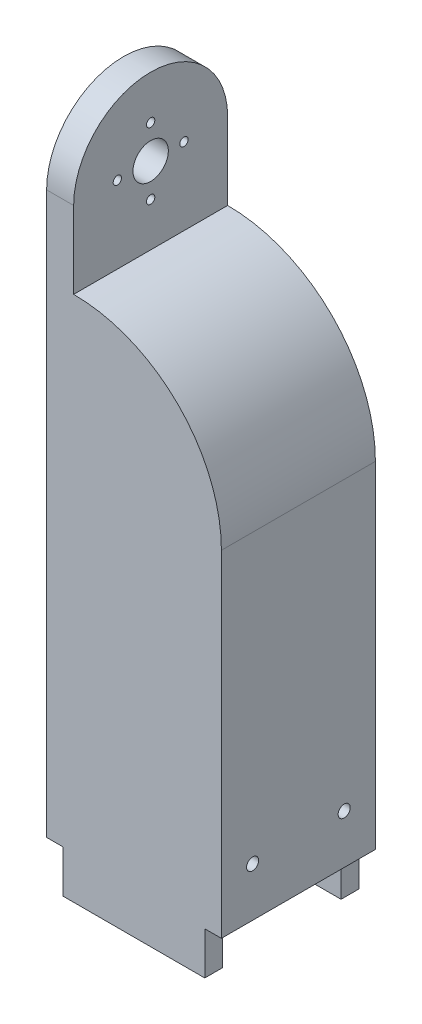
ISO-10303-21;
HEADER;
FILE_DESCRIPTION(('STEP AP214'),'2;1');
FILE_NAME('part.step','',(''),(''),'','','');
FILE_SCHEMA(('AUTOMOTIVE_DESIGN { 1 0 10303 214 1 1 1 1 }'));
ENDSEC;
DATA;
#1=APPLICATION_CONTEXT('core data for automotive mechanical design processes');
#2=APPLICATION_PROTOCOL_DEFINITION('international standard','automotive_design',2000,#1);
#3=PRODUCT_CONTEXT('',#1,'mechanical');
#4=PRODUCT('Part','Part','',(#3));
#5=PRODUCT_RELATED_PRODUCT_CATEGORY('part','',(#4));
#6=PRODUCT_DEFINITION_FORMATION('','',#4);
#7=PRODUCT_DEFINITION_CONTEXT('part definition',#1,'design');
#8=PRODUCT_DEFINITION('design','',#6,#7);
#9=PRODUCT_DEFINITION_SHAPE('','',#8);
#10=(LENGTH_UNIT() NAMED_UNIT(*) SI_UNIT(.MILLI.,.METRE.));
#11=(NAMED_UNIT(*) PLANE_ANGLE_UNIT() SI_UNIT($,.RADIAN.));
#12=(NAMED_UNIT(*) SI_UNIT($,.STERADIAN.) SOLID_ANGLE_UNIT());
#13=UNCERTAINTY_MEASURE_WITH_UNIT(LENGTH_MEASURE(1.E-05),#10,'distance_accuracy_value','');
#14=(GEOMETRIC_REPRESENTATION_CONTEXT(3) GLOBAL_UNCERTAINTY_ASSIGNED_CONTEXT((#13)) GLOBAL_UNIT_ASSIGNED_CONTEXT((#10,
#11,#12)) REPRESENTATION_CONTEXT('',''));
#15=CARTESIAN_POINT('',(0.,0.,0.));
#16=DIRECTION('',(0.,0.,1.));
#17=DIRECTION('',(1.,0.,0.));
#18=AXIS2_PLACEMENT_3D('',#15,#16,#17);
#19=CARTESIAN_POINT('',(-17.,0.,-55.));
#20=DIRECTION('',(1.,0.,0.));
#21=DIRECTION('',(0.,1.,0.));
#22=AXIS2_PLACEMENT_3D('',#19,#20,#21);
#23=PLANE('',#22);
#24=DIRECTION('',(0.,0.,1.));
#25=VECTOR('',#24,1.);
#26=CARTESIAN_POINT('',(-17.,-144.75,-55.));
#27=LINE('',#26,#25);
#28=CARTESIAN_POINT('',(-17.,-144.75,-41.75));
#29=VERTEX_POINT('',#28);
#30=CARTESIAN_POINT('',(-17.,-144.75,-13.25));
#31=VERTEX_POINT('',#30);
#32=EDGE_CURVE('E243',#29,#31,#27,.T.);
#33=ORIENTED_EDGE('',*,*,#32,.T.);
#34=DIRECTION('',(0.,1.,0.));
#35=VECTOR('',#34,1.);
#36=CARTESIAN_POINT('',(-17.,-169.75,-13.25));
#37=LINE('',#36,#35);
#38=CARTESIAN_POINT('',(-17.,-159.75,-13.25));
#39=VERTEX_POINT('',#38);
#40=EDGE_CURVE('E237',#39,#31,#37,.T.);
#41=ORIENTED_EDGE('',*,*,#40,.F.);
#42=DIRECTION('',(0.,0.,1.));
#43=VECTOR('',#42,1.);
#44=CARTESIAN_POINT('',(-17.,-159.75,-55.));
#45=LINE('',#44,#43);
#46=CARTESIAN_POINT('',(-17.,-159.75,-41.75));
#47=VERTEX_POINT('',#46);
#48=EDGE_CURVE('E213',#47,#39,#45,.T.);
#49=ORIENTED_EDGE('',*,*,#48,.F.);
#50=DIRECTION('',(0.,1.,0.));
#51=VECTOR('',#50,1.);
#52=CARTESIAN_POINT('',(-17.,-169.75,-41.75));
#53=LINE('',#52,#51);
#54=EDGE_CURVE('E220',#47,#29,#53,.T.);
#55=ORIENTED_EDGE('',*,*,#54,.T.);
#56=EDGE_LOOP('',(#33,#41,#49,#55));
#57=FACE_BOUND('',#56,.T.);
#58=CARTESIAN_POINT('',(-17.,-148.,-16.5));
#59=DIRECTION('',(1.,0.,0.));
#60=DIRECTION('',(0.,0.,-1.));
#61=AXIS2_PLACEMENT_3D('',#58,#59,#60);
#62=CIRCLE('',#61,1.45);
#63=CARTESIAN_POINT('',(-17.,-148.,-17.95));
#64=VERTEX_POINT('',#63);
#65=EDGE_CURVE('E461',#64,#64,#62,.T.);
#66=ORIENTED_EDGE('',*,*,#65,.F.);
#67=EDGE_LOOP('',(#66));
#68=FACE_BOUND('',#67,.T.);
#69=CARTESIAN_POINT('',(-17.,-148.,-38.5));
#70=DIRECTION('',(1.,0.,0.));
#71=DIRECTION('',(0.,0.,-1.));
#72=AXIS2_PLACEMENT_3D('',#69,#70,#71);
#73=CIRCLE('',#72,1.45);
#74=CARTESIAN_POINT('',(-17.,-148.,-39.95));
#75=VERTEX_POINT('',#74);
#76=EDGE_CURVE('E455',#75,#75,#73,.T.);
#77=ORIENTED_EDGE('',*,*,#76,.F.);
#78=EDGE_LOOP('',(#77));
#79=FACE_BOUND('',#78,.T.);
#80=ADVANCED_FACE('F47',(#57,#68,#79),#23,.T.);
#81=CARTESIAN_POINT('',(0.,-144.75,-55.));
#82=DIRECTION('',(0.,1.,0.));
#83=DIRECTION('',(0.,0.,1.));
#84=AXIS2_PLACEMENT_3D('',#81,#82,#83);
#85=PLANE('',#84);
#86=DIRECTION('',(-1.,0.,0.));
#87=VECTOR('',#86,1.);
#88=CARTESIAN_POINT('',(-17.,-144.75,-41.75));
#89=LINE('',#88,#87);
#90=CARTESIAN_POINT('',(17.,-144.75,-41.75));
#91=VERTEX_POINT('',#90);
#92=EDGE_CURVE('E225',#91,#29,#89,.T.);
#93=ORIENTED_EDGE('',*,*,#92,.F.);
#94=DIRECTION('',(0.,0.,1.));
#95=VECTOR('',#94,1.);
#96=CARTESIAN_POINT('',(17.,-144.75,-55.));
#97=LINE('',#96,#95);
#98=CARTESIAN_POINT('',(17.,-144.75,-13.25));
#99=VERTEX_POINT('',#98);
#100=EDGE_CURVE('E242',#91,#99,#97,.T.);
#101=ORIENTED_EDGE('',*,*,#100,.T.);
#102=DIRECTION('',(1.,0.,0.));
#103=VECTOR('',#102,1.);
#104=CARTESIAN_POINT('',(-17.,-144.75,-13.25));
#105=LINE('',#104,#103);
#106=EDGE_CURVE('E229',#31,#99,#105,.T.);
#107=ORIENTED_EDGE('',*,*,#106,.F.);
#108=ORIENTED_EDGE('',*,*,#32,.F.);
#109=EDGE_LOOP('',(#93,#101,#107,#108));
#110=FACE_BOUND('',#109,.T.);
#111=ADVANCED_FACE('F373',(#110),#85,.F.);
#112=CARTESIAN_POINT('',(17.,0.,-55.));
#113=DIRECTION('',(1.,0.,0.));
#114=DIRECTION('',(0.,0.,-1.));
#115=AXIS2_PLACEMENT_3D('',#112,#113,#114);
#116=PLANE('',#115);
#117=DIRECTION('',(0.,1.,0.));
#118=VECTOR('',#117,1.);
#119=CARTESIAN_POINT('',(17.,-169.75,-13.25));
#120=LINE('',#119,#118);
#121=CARTESIAN_POINT('',(17.,-159.75,-13.25));
#122=VERTEX_POINT('',#121);
#123=EDGE_CURVE('E233',#122,#99,#120,.T.);
#124=ORIENTED_EDGE('',*,*,#123,.T.);
#125=ORIENTED_EDGE('',*,*,#100,.F.);
#126=DIRECTION('',(0.,1.,0.));
#127=VECTOR('',#126,1.);
#128=CARTESIAN_POINT('',(17.,-169.75,-41.75));
#129=LINE('',#128,#127);
#130=CARTESIAN_POINT('',(17.,-159.75,-41.75));
#131=VERTEX_POINT('',#130);
#132=EDGE_CURVE('E216',#131,#91,#129,.T.);
#133=ORIENTED_EDGE('',*,*,#132,.F.);
#134=DIRECTION('',(0.,0.,1.));
#135=VECTOR('',#134,1.);
#136=CARTESIAN_POINT('',(17.,-159.75,-55.));
#137=LINE('',#136,#135);
#138=EDGE_CURVE('E217',#131,#122,#137,.T.);
#139=ORIENTED_EDGE('',*,*,#138,.T.);
#140=EDGE_LOOP('',(#124,#125,#133,#139));
#141=FACE_BOUND('',#140,.T.);
#142=CARTESIAN_POINT('',(17.,-148.,-16.5));
#143=DIRECTION('',(1.,0.,0.));
#144=DIRECTION('',(0.,0.,-1.));
#145=AXIS2_PLACEMENT_3D('',#142,#143,#144);
#146=CIRCLE('',#145,1.45);
#147=CARTESIAN_POINT('',(17.,-148.,-17.95));
#148=VERTEX_POINT('',#147);
#149=EDGE_CURVE('E264',#148,#148,#146,.T.);
#150=ORIENTED_EDGE('',*,*,#149,.T.);
#151=EDGE_LOOP('',(#150));
#152=FACE_BOUND('',#151,.T.);
#153=CARTESIAN_POINT('',(17.,-148.,-38.5));
#154=DIRECTION('',(1.,0.,0.));
#155=DIRECTION('',(0.,0.,-1.));
#156=AXIS2_PLACEMENT_3D('',#153,#154,#155);
#157=CIRCLE('',#156,1.45);
#158=CARTESIAN_POINT('',(17.,-148.,-39.95));
#159=VERTEX_POINT('',#158);
#160=EDGE_CURVE('E465',#159,#159,#157,.T.);
#161=ORIENTED_EDGE('',*,*,#160,.T.);
#162=EDGE_LOOP('',(#161));
#163=FACE_BOUND('',#162,.T.);
#164=ADVANCED_FACE('F380',(#141,#152,#163),#116,.F.);
#165=CARTESIAN_POINT('',(-30.,-25.,-19.5000000000001));
#166=DIRECTION('',(1.,0.,0.));
#167=DIRECTION('',(0.,1.,0.));
#168=AXIS2_PLACEMENT_3D('',#165,#166,#167);
#169=CYLINDRICAL_SURFACE('',#168,1.);
#170=CARTESIAN_POINT('',(-21.,-25.,-19.5000000000001));
#171=DIRECTION('',(1.,0.,0.));
#172=DIRECTION('',(0.,0.,-1.));
#173=AXIS2_PLACEMENT_3D('',#170,#171,#172);
#174=CIRCLE('',#173,1.);
#175=CARTESIAN_POINT('',(-21.,-25.,-20.5000000000001));
#176=VERTEX_POINT('',#175);
#177=EDGE_CURVE('E301',#176,#176,#174,.F.);
#178=ORIENTED_EDGE('',*,*,#177,.T.);
#179=EDGE_LOOP('',(#178));
#180=FACE_BOUND('',#179,.T.);
#181=CARTESIAN_POINT('',(-14.5,-25.,-19.5000000000001));
#182=DIRECTION('',(1.,0.,0.));
#183=DIRECTION('',(0.,1.,0.));
#184=AXIS2_PLACEMENT_3D('',#181,#182,#183);
#185=CIRCLE('',#184,1.);
#186=CARTESIAN_POINT('',(-14.5,-24.,-19.5000000000001));
#187=VERTEX_POINT('',#186);
#188=EDGE_CURVE('E326',#187,#187,#185,.F.);
#189=ORIENTED_EDGE('',*,*,#188,.F.);
#190=EDGE_LOOP('',(#189));
#191=FACE_BOUND('',#190,.T.);
#192=ADVANCED_FACE('F390',(#180,#191),#169,.F.);
#193=CARTESIAN_POINT('',(-30.,-33.,-27.5000000000002));
#194=DIRECTION('',(1.,0.,0.));
#195=DIRECTION('',(0.,1.,0.));
#196=AXIS2_PLACEMENT_3D('',#193,#194,#195);
#197=CYLINDRICAL_SURFACE('',#196,1.);
#198=CARTESIAN_POINT('',(-21.,-33.,-27.5000000000002));
#199=DIRECTION('',(1.,0.,0.));
#200=DIRECTION('',(0.,0.,-1.));
#201=AXIS2_PLACEMENT_3D('',#198,#199,#200);
#202=CIRCLE('',#201,1.);
#203=CARTESIAN_POINT('',(-21.,-33.,-28.5000000000002));
#204=VERTEX_POINT('',#203);
#205=EDGE_CURVE('E297',#204,#204,#202,.F.);
#206=ORIENTED_EDGE('',*,*,#205,.T.);
#207=EDGE_LOOP('',(#206));
#208=FACE_BOUND('',#207,.T.);
#209=CARTESIAN_POINT('',(-14.5,-33.,-27.5000000000002));
#210=DIRECTION('',(1.,0.,0.));
#211=DIRECTION('',(0.,1.,0.));
#212=AXIS2_PLACEMENT_3D('',#209,#210,#211);
#213=CIRCLE('',#212,1.);
#214=CARTESIAN_POINT('',(-14.5,-32.,-27.5000000000002));
#215=VERTEX_POINT('',#214);
#216=EDGE_CURVE('E330',#215,#215,#213,.F.);
#217=ORIENTED_EDGE('',*,*,#216,.F.);
#218=EDGE_LOOP('',(#217));
#219=FACE_BOUND('',#218,.T.);
#220=ADVANCED_FACE('F49',(#208,#219),#197,.F.);
#221=CARTESIAN_POINT('',(-30.,-24.9999999999999,-35.5000000000001));
#222=DIRECTION('',(1.,0.,0.));
#223=DIRECTION('',(0.,1.,0.));
#224=AXIS2_PLACEMENT_3D('',#221,#222,#223);
#225=CYLINDRICAL_SURFACE('',#224,1.);
#226=CARTESIAN_POINT('',(-21.,-24.9999999999999,-35.5000000000001));
#227=DIRECTION('',(1.,0.,0.));
#228=DIRECTION('',(0.,0.,-1.));
#229=AXIS2_PLACEMENT_3D('',#226,#227,#228);
#230=CIRCLE('',#229,1.);
#231=CARTESIAN_POINT('',(-21.,-24.9999999999999,-36.5000000000001));
#232=VERTEX_POINT('',#231);
#233=EDGE_CURVE('E293',#232,#232,#230,.F.);
#234=ORIENTED_EDGE('',*,*,#233,.T.);
#235=EDGE_LOOP('',(#234));
#236=FACE_BOUND('',#235,.T.);
#237=CARTESIAN_POINT('',(-14.5,-24.9999999999999,-35.5000000000001));
#238=DIRECTION('',(1.,0.,0.));
#239=DIRECTION('',(0.,1.,0.));
#240=AXIS2_PLACEMENT_3D('',#237,#238,#239);
#241=CIRCLE('',#240,1.);
#242=CARTESIAN_POINT('',(-14.5,-23.9999999999999,-35.5000000000001));
#243=VERTEX_POINT('',#242);
#244=EDGE_CURVE('E318',#243,#243,#241,.F.);
#245=ORIENTED_EDGE('',*,*,#244,.F.);
#246=EDGE_LOOP('',(#245));
#247=FACE_BOUND('',#246,.T.);
#248=ADVANCED_FACE('F396',(#236,#247),#225,.F.);
#249=CARTESIAN_POINT('',(-30.,-17.,-27.5));
#250=DIRECTION('',(1.,0.,0.));
#251=DIRECTION('',(0.,1.,0.));
#252=AXIS2_PLACEMENT_3D('',#249,#250,#251);
#253=CYLINDRICAL_SURFACE('',#252,1.);
#254=CARTESIAN_POINT('',(-21.,-17.,-27.5));
#255=DIRECTION('',(1.,0.,0.));
#256=DIRECTION('',(0.,0.,-1.));
#257=AXIS2_PLACEMENT_3D('',#254,#255,#256);
#258=CIRCLE('',#257,1.);
#259=CARTESIAN_POINT('',(-21.,-17.,-28.5));
#260=VERTEX_POINT('',#259);
#261=EDGE_CURVE('E289',#260,#260,#258,.F.);
#262=ORIENTED_EDGE('',*,*,#261,.T.);
#263=EDGE_LOOP('',(#262));
#264=FACE_BOUND('',#263,.T.);
#265=CARTESIAN_POINT('',(-14.5,-17.,-27.5));
#266=DIRECTION('',(1.,0.,0.));
#267=DIRECTION('',(0.,1.,0.));
#268=AXIS2_PLACEMENT_3D('',#265,#266,#267);
#269=CIRCLE('',#268,1.);
#270=CARTESIAN_POINT('',(-14.5,-16.,-27.5));
#271=VERTEX_POINT('',#270);
#272=EDGE_CURVE('E334',#271,#271,#269,.F.);
#273=ORIENTED_EDGE('',*,*,#272,.F.);
#274=EDGE_LOOP('',(#273));
#275=FACE_BOUND('',#274,.T.);
#276=ADVANCED_FACE('F392',(#264,#275),#253,.F.);
#277=CARTESIAN_POINT('',(-30.,-25.,-27.5));
#278=DIRECTION('',(1.,0.,0.));
#279=DIRECTION('',(0.,1.,0.));
#280=AXIS2_PLACEMENT_3D('',#277,#278,#279);
#281=CYLINDRICAL_SURFACE('',#280,4.25);
#282=CARTESIAN_POINT('',(-21.,-25.,-27.5));
#283=DIRECTION('',(1.,0.,0.));
#284=DIRECTION('',(0.,0.,-1.));
#285=AXIS2_PLACEMENT_3D('',#282,#283,#284);
#286=CIRCLE('',#285,4.25);
#287=CARTESIAN_POINT('',(-21.,-25.,-31.75));
#288=VERTEX_POINT('',#287);
#289=EDGE_CURVE('E285',#288,#288,#286,.F.);
#290=ORIENTED_EDGE('',*,*,#289,.T.);
#291=EDGE_LOOP('',(#290));
#292=FACE_BOUND('',#291,.T.);
#293=CARTESIAN_POINT('',(-14.5,-25.,-27.5));
#294=DIRECTION('',(1.,0.,0.));
#295=DIRECTION('',(0.,1.,0.));
#296=AXIS2_PLACEMENT_3D('',#293,#294,#295);
#297=CIRCLE('',#296,4.25);
#298=CARTESIAN_POINT('',(-14.5,-20.75,-27.5));
#299=VERTEX_POINT('',#298);
#300=EDGE_CURVE('E322',#299,#299,#297,.F.);
#301=ORIENTED_EDGE('',*,*,#300,.F.);
#302=EDGE_LOOP('',(#301));
#303=FACE_BOUND('',#302,.T.);
#304=ADVANCED_FACE('F395',(#292,#303),#281,.F.);
#305=CARTESIAN_POINT('',(-17.,-169.75,-13.25));
#306=DIRECTION('',(0.,0.,1.));
#307=DIRECTION('',(1.,0.,0.));
#308=AXIS2_PLACEMENT_3D('',#305,#306,#307);
#309=PLANE('',#308);
#310=ORIENTED_EDGE('',*,*,#106,.T.);
#311=ORIENTED_EDGE('',*,*,#123,.F.);
#312=CARTESIAN_POINT('',(17.,-170.,-13.25));
#313=VERTEX_POINT('',#312);
#314=EDGE_CURVE('E234',#313,#122,#120,.T.);
#315=ORIENTED_EDGE('',*,*,#314,.F.);
#316=DIRECTION('',(1.,0.,0.));
#317=VECTOR('',#316,1.);
#318=CARTESIAN_POINT('',(0.,-170.,-13.25));
#319=LINE('',#318,#317);
#320=CARTESIAN_POINT('',(-17.,-170.,-13.25));
#321=VERTEX_POINT('',#320);
#322=EDGE_CURVE('E192',#321,#313,#319,.T.);
#323=ORIENTED_EDGE('',*,*,#322,.F.);
#324=EDGE_CURVE('E238',#321,#39,#37,.T.);
#325=ORIENTED_EDGE('',*,*,#324,.T.);
#326=ORIENTED_EDGE('',*,*,#40,.T.);
#327=EDGE_LOOP('',(#310,#311,#315,#323,#325,#326));
#328=FACE_BOUND('',#327,.T.);
#329=ADVANCED_FACE('F385',(#328),#309,.F.);
#330=CARTESIAN_POINT('',(-17.,-169.75,-41.75));
#331=DIRECTION('',(0.,0.,-1.));
#332=DIRECTION('',(-1.,0.,0.));
#333=AXIS2_PLACEMENT_3D('',#330,#331,#332);
#334=PLANE('',#333);
#335=ORIENTED_EDGE('',*,*,#92,.T.);
#336=ORIENTED_EDGE('',*,*,#54,.F.);
#337=CARTESIAN_POINT('',(-17.,-170.,-41.75));
#338=VERTEX_POINT('',#337);
#339=EDGE_CURVE('E221',#338,#47,#53,.T.);
#340=ORIENTED_EDGE('',*,*,#339,.F.);
#341=DIRECTION('',(1.,0.,0.));
#342=VECTOR('',#341,1.);
#343=CARTESIAN_POINT('',(0.,-170.,-41.75));
#344=LINE('',#343,#342);
#345=CARTESIAN_POINT('',(17.,-170.,-41.75));
#346=VERTEX_POINT('',#345);
#347=EDGE_CURVE('E188',#338,#346,#344,.T.);
#348=ORIENTED_EDGE('',*,*,#347,.T.);
#349=EDGE_CURVE('E185',#346,#131,#129,.T.);
#350=ORIENTED_EDGE('',*,*,#349,.T.);
#351=ORIENTED_EDGE('',*,*,#132,.T.);
#352=EDGE_LOOP('',(#335,#336,#340,#348,#350,#351));
#353=FACE_BOUND('',#352,.T.);
#354=ADVANCED_FACE('F525',(#353),#334,.F.);
#355=CARTESIAN_POINT('',(17.,0.,0.));
#356=DIRECTION('',(1.,0.,0.));
#357=DIRECTION('',(0.,1.,0.));
#358=AXIS2_PLACEMENT_3D('',#355,#356,#357);
#359=PLANE('',#358);
#360=DIRECTION('',(0.,1.,0.));
#361=VECTOR('',#360,1.);
#362=CARTESIAN_POINT('',(17.,0.,-9.00000000000001));
#363=LINE('',#362,#361);
#364=CARTESIAN_POINT('',(17.,-170.,-9.00000000000001));
#365=VERTEX_POINT('',#364);
#366=CARTESIAN_POINT('',(17.,-159.75,-9.00000000000001));
#367=VERTEX_POINT('',#366);
#368=EDGE_CURVE('E269',#365,#367,#363,.T.);
#369=ORIENTED_EDGE('',*,*,#368,.F.);
#370=DIRECTION('',(0.,0.,1.));
#371=VECTOR('',#370,1.);
#372=CARTESIAN_POINT('',(17.,-170.,-13.25));
#373=LINE('',#372,#371);
#374=EDGE_CURVE('E201',#313,#365,#373,.T.);
#375=ORIENTED_EDGE('',*,*,#374,.F.);
#376=ORIENTED_EDGE('',*,*,#314,.T.);
#377=EDGE_CURVE('E212',#122,#367,#137,.T.);
#378=ORIENTED_EDGE('',*,*,#377,.T.);
#379=EDGE_LOOP('',(#369,#375,#376,#378));
#380=FACE_BOUND('',#379,.T.);
#381=ADVANCED_FACE('F507',(#380),#359,.T.);
#382=DIRECTION('',(0.,-1.,0.));
#383=VECTOR('',#382,1.);
#384=CARTESIAN_POINT('',(17.,0.,-46.));
#385=LINE('',#384,#383);
#386=CARTESIAN_POINT('',(17.,-159.75,-46.));
#387=VERTEX_POINT('',#386);
#388=CARTESIAN_POINT('',(17.,-170.,-46.));
#389=VERTEX_POINT('',#388);
#390=EDGE_CURVE('E159',#387,#389,#385,.T.);
#391=ORIENTED_EDGE('',*,*,#390,.F.);
#392=EDGE_CURVE('E70',#387,#131,#137,.T.);
#393=ORIENTED_EDGE('',*,*,#392,.T.);
#394=ORIENTED_EDGE('',*,*,#349,.F.);
#395=DIRECTION('',(0.,0.,-1.));
#396=VECTOR('',#395,1.);
#397=CARTESIAN_POINT('',(17.,-170.,-41.75));
#398=LINE('',#397,#396);
#399=EDGE_CURVE('E176',#346,#389,#398,.T.);
#400=ORIENTED_EDGE('',*,*,#399,.T.);
#401=EDGE_LOOP('',(#391,#393,#394,#400));
#402=FACE_BOUND('',#401,.T.);
#403=ADVANCED_FACE('F183',(#402),#359,.T.);
#404=CARTESIAN_POINT('',(17.,-159.75,-55.));
#405=DIRECTION('',(0.,1.,0.));
#406=DIRECTION('',(-1.,0.,0.));
#407=AXIS2_PLACEMENT_3D('',#404,#405,#406);
#408=PLANE('',#407);
#409=DIRECTION('',(0.,0.,1.));
#410=VECTOR('',#409,1.);
#411=CARTESIAN_POINT('',(21.,-159.75,-55.));
#412=LINE('',#411,#410);
#413=CARTESIAN_POINT('',(21.,-159.75,-46.));
#414=VERTEX_POINT('',#413);
#415=CARTESIAN_POINT('',(21.,-159.75,-9.00000000000001));
#416=VERTEX_POINT('',#415);
#417=EDGE_CURVE('E262',#414,#416,#412,.T.);
#418=ORIENTED_EDGE('',*,*,#417,.T.);
#419=DIRECTION('',(-1.,0.,0.));
#420=VECTOR('',#419,1.);
#421=CARTESIAN_POINT('',(17.,-159.75,-9.00000000000001));
#422=LINE('',#421,#420);
#423=EDGE_CURVE('E276',#416,#367,#422,.T.);
#424=ORIENTED_EDGE('',*,*,#423,.T.);
#425=ORIENTED_EDGE('',*,*,#377,.F.);
#426=ORIENTED_EDGE('',*,*,#138,.F.);
#427=ORIENTED_EDGE('',*,*,#392,.F.);
#428=DIRECTION('',(1.,0.,0.));
#429=VECTOR('',#428,1.);
#430=CARTESIAN_POINT('',(17.,-159.75,-46.));
#431=LINE('',#430,#429);
#432=EDGE_CURVE('E166',#387,#414,#431,.T.);
#433=ORIENTED_EDGE('',*,*,#432,.T.);
#434=EDGE_LOOP('',(#418,#424,#425,#426,#427,#433));
#435=FACE_BOUND('',#434,.T.);
#436=ADVANCED_FACE('F503',(#435),#408,.F.);
#437=CARTESIAN_POINT('',(-17.,0.,0.));
#438=DIRECTION('',(-1.,0.,0.));
#439=DIRECTION('',(0.,1.,0.));
#440=AXIS2_PLACEMENT_3D('',#437,#438,#439);
#441=PLANE('',#440);
#442=DIRECTION('',(0.,-1.,0.));
#443=VECTOR('',#442,1.);
#444=CARTESIAN_POINT('',(-17.,0.,-9.00000000000001));
#445=LINE('',#444,#443);
#446=CARTESIAN_POINT('',(-17.,-159.75,-9.00000000000001));
#447=VERTEX_POINT('',#446);
#448=CARTESIAN_POINT('',(-17.,-170.,-9.00000000000001));
#449=VERTEX_POINT('',#448);
#450=EDGE_CURVE('E496',#447,#449,#445,.T.);
#451=ORIENTED_EDGE('',*,*,#450,.F.);
#452=EDGE_CURVE('E205',#39,#447,#45,.T.);
#453=ORIENTED_EDGE('',*,*,#452,.F.);
#454=ORIENTED_EDGE('',*,*,#324,.F.);
#455=DIRECTION('',(0.,0.,1.));
#456=VECTOR('',#455,1.);
#457=CARTESIAN_POINT('',(-17.,-170.,-13.25));
#458=LINE('',#457,#456);
#459=EDGE_CURVE('E200',#321,#449,#458,.T.);
#460=ORIENTED_EDGE('',*,*,#459,.T.);
#461=EDGE_LOOP('',(#451,#453,#454,#460));
#462=FACE_BOUND('',#461,.T.);
#463=ADVANCED_FACE('F534',(#462),#441,.T.);
#464=DIRECTION('',(0.,1.,0.));
#465=VECTOR('',#464,1.);
#466=CARTESIAN_POINT('',(-17.,0.,-46.));
#467=LINE('',#466,#465);
#468=CARTESIAN_POINT('',(-17.,-170.,-46.));
#469=VERTEX_POINT('',#468);
#470=CARTESIAN_POINT('',(-17.,-159.75,-46.));
#471=VERTEX_POINT('',#470);
#472=EDGE_CURVE('E489',#469,#471,#467,.T.);
#473=ORIENTED_EDGE('',*,*,#472,.F.);
#474=DIRECTION('',(0.,0.,-1.));
#475=VECTOR('',#474,1.);
#476=CARTESIAN_POINT('',(-17.,-170.,-41.75));
#477=LINE('',#476,#475);
#478=EDGE_CURVE('E178',#338,#469,#477,.T.);
#479=ORIENTED_EDGE('',*,*,#478,.F.);
#480=ORIENTED_EDGE('',*,*,#339,.T.);
#481=EDGE_CURVE('E209',#471,#47,#45,.T.);
#482=ORIENTED_EDGE('',*,*,#481,.F.);
#483=EDGE_LOOP('',(#473,#479,#480,#482));
#484=FACE_BOUND('',#483,.T.);
#485=ADVANCED_FACE('F547',(#484),#441,.T.);
#486=CARTESIAN_POINT('',(-17.,-159.75,-55.));
#487=DIRECTION('',(0.,-1.,0.));
#488=DIRECTION('',(1.,0.,0.));
#489=AXIS2_PLACEMENT_3D('',#486,#487,#488);
#490=PLANE('',#489);
#491=DIRECTION('',(1.,0.,0.));
#492=VECTOR('',#491,1.);
#493=CARTESIAN_POINT('',(-17.,-159.75,-9.00000000000001));
#494=LINE('',#493,#492);
#495=CARTESIAN_POINT('',(-21.,-159.75,-9.00000000000001));
#496=VERTEX_POINT('',#495);
#497=EDGE_CURVE('E169',#496,#447,#494,.T.);
#498=ORIENTED_EDGE('',*,*,#497,.F.);
#499=DIRECTION('',(0.,0.,1.));
#500=VECTOR('',#499,1.);
#501=CARTESIAN_POINT('',(-21.,-159.75,-55.));
#502=LINE('',#501,#500);
#503=CARTESIAN_POINT('',(-21.,-159.75,-46.));
#504=VERTEX_POINT('',#503);
#505=EDGE_CURVE('E338',#504,#496,#502,.T.);
#506=ORIENTED_EDGE('',*,*,#505,.F.);
#507=DIRECTION('',(-1.,0.,0.));
#508=VECTOR('',#507,1.);
#509=CARTESIAN_POINT('',(-17.,-159.75,-46.));
#510=LINE('',#509,#508);
#511=EDGE_CURVE('E485',#471,#504,#510,.T.);
#512=ORIENTED_EDGE('',*,*,#511,.F.);
#513=ORIENTED_EDGE('',*,*,#481,.T.);
#514=ORIENTED_EDGE('',*,*,#48,.T.);
#515=ORIENTED_EDGE('',*,*,#452,.T.);
#516=EDGE_LOOP('',(#498,#506,#512,#513,#514,#515));
#517=FACE_BOUND('',#516,.T.);
#518=ADVANCED_FACE('F541',(#517),#490,.T.);
#519=CARTESIAN_POINT('',(0.,-170.,-13.25));
#520=DIRECTION('',(0.,-1.,0.));
#521=DIRECTION('',(0.,0.,-1.));
#522=AXIS2_PLACEMENT_3D('',#519,#520,#521);
#523=PLANE('',#522);
#524=DIRECTION('',(1.,0.,0.));
#525=VECTOR('',#524,1.);
#526=CARTESIAN_POINT('',(-21.,-170.,-9.00000000000001));
#527=LINE('',#526,#525);
#528=EDGE_CURVE('E180',#449,#365,#527,.T.);
#529=ORIENTED_EDGE('',*,*,#528,.F.);
#530=ORIENTED_EDGE('',*,*,#459,.F.);
#531=ORIENTED_EDGE('',*,*,#322,.T.);
#532=ORIENTED_EDGE('',*,*,#374,.T.);
#533=EDGE_LOOP('',(#529,#530,#531,#532));
#534=FACE_BOUND('',#533,.T.);
#535=ADVANCED_FACE('F539',(#534),#523,.T.);
#536=CARTESIAN_POINT('',(0.,-170.,-41.75));
#537=DIRECTION('',(0.,1.,0.));
#538=DIRECTION('',(0.,0.,1.));
#539=AXIS2_PLACEMENT_3D('',#536,#537,#538);
#540=PLANE('',#539);
#541=ORIENTED_EDGE('',*,*,#478,.T.);
#542=DIRECTION('',(-1.,0.,0.));
#543=VECTOR('',#542,1.);
#544=CARTESIAN_POINT('',(21.,-170.,-46.));
#545=LINE('',#544,#543);
#546=EDGE_CURVE('E163',#389,#469,#545,.T.);
#547=ORIENTED_EDGE('',*,*,#546,.F.);
#548=ORIENTED_EDGE('',*,*,#399,.F.);
#549=ORIENTED_EDGE('',*,*,#347,.F.);
#550=EDGE_LOOP('',(#541,#547,#548,#549));
#551=FACE_BOUND('',#550,.T.);
#552=ADVANCED_FACE('F174',(#551),#540,.F.);
#553=CARTESIAN_POINT('',(-25.,-25.,-27.5));
#554=DIRECTION('',(1.,0.,0.));
#555=DIRECTION('',(0.,1.,0.));
#556=AXIS2_PLACEMENT_3D('',#553,#554,#555);
#557=CYLINDRICAL_SURFACE('',#556,18.5);
#558=DIRECTION('',(1.,0.,0.));
#559=VECTOR('',#558,1.);
#560=CARTESIAN_POINT('',(-25.,-25.,-46.));
#561=LINE('',#560,#559);
#562=CARTESIAN_POINT('',(-21.,-25.,-46.));
#563=VERTEX_POINT('',#562);
#564=CARTESIAN_POINT('',(-14.5,-25.,-46.));
#565=VERTEX_POINT('',#564);
#566=EDGE_CURVE('E342',#563,#565,#561,.T.);
#567=ORIENTED_EDGE('',*,*,#566,.F.);
#568=CARTESIAN_POINT('',(-21.,-25.,-27.5));
#569=DIRECTION('',(1.,0.,0.));
#570=DIRECTION('',(0.,0.,-1.));
#571=AXIS2_PLACEMENT_3D('',#568,#569,#570);
#572=CIRCLE('',#571,18.5);
#573=CARTESIAN_POINT('',(-21.,-25.,-9.00000000000001));
#574=VERTEX_POINT('',#573);
#575=EDGE_CURVE('E274',#574,#563,#572,.F.);
#576=ORIENTED_EDGE('',*,*,#575,.F.);
#577=DIRECTION('',(1.,0.,0.));
#578=VECTOR('',#577,1.);
#579=CARTESIAN_POINT('',(-25.,-25.,-9.00000000000001));
#580=LINE('',#579,#578);
#581=CARTESIAN_POINT('',(-14.5,-25.,-9.00000000000001));
#582=VERTEX_POINT('',#581);
#583=EDGE_CURVE('E194',#574,#582,#580,.T.);
#584=ORIENTED_EDGE('',*,*,#583,.T.);
#585=CARTESIAN_POINT('',(-14.5,-25.,-27.5));
#586=DIRECTION('',(1.,0.,0.));
#587=DIRECTION('',(0.,1.,0.));
#588=AXIS2_PLACEMENT_3D('',#585,#586,#587);
#589=CIRCLE('',#588,18.5);
#590=EDGE_CURVE('E305',#565,#582,#589,.T.);
#591=ORIENTED_EDGE('',*,*,#590,.F.);
#592=EDGE_LOOP('',(#567,#576,#584,#591));
#593=FACE_BOUND('',#592,.T.);
#594=ADVANCED_FACE('F356',(#593),#557,.T.);
#595=CARTESIAN_POINT('',(-25.,0.,-9.00000000000001));
#596=DIRECTION('',(0.,0.,1.));
#597=DIRECTION('',(1.,0.,0.));
#598=AXIS2_PLACEMENT_3D('',#595,#596,#597);
#599=PLANE('',#598);
#600=DIRECTION('',(0.,1.,0.));
#601=VECTOR('',#600,1.);
#602=CARTESIAN_POINT('',(-21.,0.,-9.00000000000001));
#603=LINE('',#602,#601);
#604=EDGE_CURVE('E282',#496,#574,#603,.T.);
#605=ORIENTED_EDGE('',*,*,#604,.F.);
#606=ORIENTED_EDGE('',*,*,#497,.T.);
#607=ORIENTED_EDGE('',*,*,#450,.T.);
#608=ORIENTED_EDGE('',*,*,#528,.T.);
#609=ORIENTED_EDGE('',*,*,#368,.T.);
#610=ORIENTED_EDGE('',*,*,#423,.F.);
#611=DIRECTION('',(0.,-1.,0.));
#612=VECTOR('',#611,1.);
#613=CARTESIAN_POINT('',(21.,-6.50000000000003,-9.00000000000001));
#614=LINE('',#613,#612);
#615=CARTESIAN_POINT('',(21.,-79.0000000000003,-9.00000000000001));
#616=VERTEX_POINT('',#615);
#617=EDGE_CURVE('E62',#616,#416,#614,.T.);
#618=ORIENTED_EDGE('',*,*,#617,.F.);
#619=CARTESIAN_POINT('',(-14.5,-79.,-9.00000000000001));
#620=DIRECTION('',(0.,0.,-1.));
#621=DIRECTION('',(-1.,0.,0.));
#622=AXIS2_PLACEMENT_3D('',#619,#620,#621);
#623=CIRCLE('',#622,35.5);
#624=CARTESIAN_POINT('',(-14.5000000000002,-43.5,-9.00000000000001));
#625=VERTEX_POINT('',#624);
#626=EDGE_CURVE('E11',#616,#625,#623,.F.);
#627=ORIENTED_EDGE('',*,*,#626,.T.);
#628=DIRECTION('',(0.,-1.,0.));
#629=VECTOR('',#628,1.);
#630=CARTESIAN_POINT('',(-14.5,0.,-9.00000000000001));
#631=LINE('',#630,#629);
#632=EDGE_CURVE('E309',#582,#625,#631,.T.);
#633=ORIENTED_EDGE('',*,*,#632,.F.);
#634=ORIENTED_EDGE('',*,*,#583,.F.);
#635=EDGE_LOOP('',(#605,#606,#607,#608,#609,#610,#618,#627,#633,#634));
#636=FACE_BOUND('',#635,.T.);
#637=ADVANCED_FACE('F359',(#636),#599,.T.);
#638=CARTESIAN_POINT('',(-25.,0.,-46.));
#639=DIRECTION('',(0.,0.,1.));
#640=DIRECTION('',(1.,0.,0.));
#641=AXIS2_PLACEMENT_3D('',#638,#639,#640);
#642=PLANE('',#641);
#643=DIRECTION('',(0.,1.,0.));
#644=VECTOR('',#643,1.);
#645=CARTESIAN_POINT('',(-14.5,0.,-46.));
#646=LINE('',#645,#644);
#647=CARTESIAN_POINT('',(-14.5,-43.5,-46.));
#648=VERTEX_POINT('',#647);
#649=EDGE_CURVE('E250',#648,#565,#646,.T.);
#650=ORIENTED_EDGE('',*,*,#649,.F.);
#651=CARTESIAN_POINT('',(-14.5,-79.,-46.));
#652=DIRECTION('',(0.,0.,1.));
#653=DIRECTION('',(1.,0.,0.));
#654=AXIS2_PLACEMENT_3D('',#651,#652,#653);
#655=CIRCLE('',#654,35.5);
#656=CARTESIAN_POINT('',(21.,-79.,-46.));
#657=VERTEX_POINT('',#656);
#658=EDGE_CURVE('E56',#648,#657,#655,.F.);
#659=ORIENTED_EDGE('',*,*,#658,.T.);
#660=DIRECTION('',(0.,-1.,0.));
#661=VECTOR('',#660,1.);
#662=CARTESIAN_POINT('',(21.,-6.50000000000003,-46.));
#663=LINE('',#662,#661);
#664=EDGE_CURVE('E181',#657,#414,#663,.T.);
#665=ORIENTED_EDGE('',*,*,#664,.T.);
#666=ORIENTED_EDGE('',*,*,#432,.F.);
#667=ORIENTED_EDGE('',*,*,#390,.T.);
#668=ORIENTED_EDGE('',*,*,#546,.T.);
#669=ORIENTED_EDGE('',*,*,#472,.T.);
#670=ORIENTED_EDGE('',*,*,#511,.T.);
#671=DIRECTION('',(0.,1.,0.));
#672=VECTOR('',#671,1.);
#673=CARTESIAN_POINT('',(-21.,0.,-46.));
#674=LINE('',#673,#672);
#675=EDGE_CURVE('E268',#504,#563,#674,.T.);
#676=ORIENTED_EDGE('',*,*,#675,.T.);
#677=ORIENTED_EDGE('',*,*,#566,.T.);
#678=EDGE_LOOP('',(#650,#659,#665,#666,#667,#668,#669,#670,#676,#677));
#679=FACE_BOUND('',#678,.T.);
#680=ADVANCED_FACE('F162',(#679),#642,.F.);
#681=CARTESIAN_POINT('',(-21.,-159.75,-55.));
#682=DIRECTION('',(1.,0.,0.));
#683=DIRECTION('',(0.,0.,-1.));
#684=AXIS2_PLACEMENT_3D('',#681,#682,#683);
#685=PLANE('',#684);
#686=ORIENTED_EDGE('',*,*,#505,.T.);
#687=ORIENTED_EDGE('',*,*,#604,.T.);
#688=ORIENTED_EDGE('',*,*,#575,.T.);
#689=ORIENTED_EDGE('',*,*,#675,.F.);
#690=EDGE_LOOP('',(#686,#687,#688,#689));
#691=FACE_BOUND('',#690,.T.);
#692=ORIENTED_EDGE('',*,*,#205,.F.);
#693=EDGE_LOOP('',(#692));
#694=FACE_BOUND('',#693,.T.);
#695=ORIENTED_EDGE('',*,*,#261,.F.);
#696=EDGE_LOOP('',(#695));
#697=FACE_BOUND('',#696,.T.);
#698=ORIENTED_EDGE('',*,*,#289,.F.);
#699=EDGE_LOOP('',(#698));
#700=FACE_BOUND('',#699,.T.);
#701=ORIENTED_EDGE('',*,*,#233,.F.);
#702=EDGE_LOOP('',(#701));
#703=FACE_BOUND('',#702,.T.);
#704=ORIENTED_EDGE('',*,*,#177,.F.);
#705=EDGE_LOOP('',(#704));
#706=FACE_BOUND('',#705,.T.);
#707=CARTESIAN_POINT('',(-21.,-148.,-16.5));
#708=DIRECTION('',(1.,0.,0.));
#709=DIRECTION('',(0.,0.,-1.));
#710=AXIS2_PLACEMENT_3D('',#707,#708,#709);
#711=CIRCLE('',#710,1.45);
#712=CARTESIAN_POINT('',(-21.,-148.,-17.95));
#713=VERTEX_POINT('',#712);
#714=EDGE_CURVE('E449',#713,#713,#711,.T.);
#715=ORIENTED_EDGE('',*,*,#714,.T.);
#716=EDGE_LOOP('',(#715));
#717=FACE_BOUND('',#716,.T.);
#718=CARTESIAN_POINT('',(-21.,-148.,-38.5));
#719=DIRECTION('',(1.,0.,0.));
#720=DIRECTION('',(0.,0.,-1.));
#721=AXIS2_PLACEMENT_3D('',#718,#719,#720);
#722=CIRCLE('',#721,1.45);
#723=CARTESIAN_POINT('',(-21.,-148.,-39.95));
#724=VERTEX_POINT('',#723);
#725=EDGE_CURVE('E452',#724,#724,#722,.T.);
#726=ORIENTED_EDGE('',*,*,#725,.T.);
#727=EDGE_LOOP('',(#726));
#728=FACE_BOUND('',#727,.T.);
#729=ADVANCED_FACE('F367',(#691,#694,#697,#700,#703,#706,#717,#728),#685,.F.);
#730=CARTESIAN_POINT('',(21.,-159.75,-55.));
#731=DIRECTION('',(-1.,0.,0.));
#732=DIRECTION('',(0.,0.,1.));
#733=AXIS2_PLACEMENT_3D('',#730,#731,#732);
#734=PLANE('',#733);
#735=DIRECTION('',(0.,0.,1.));
#736=VECTOR('',#735,1.);
#737=CARTESIAN_POINT('',(21.,-79.0000000000003,-55.));
#738=LINE('',#737,#736);
#739=EDGE_CURVE('E260',#657,#616,#738,.T.);
#740=ORIENTED_EDGE('',*,*,#739,.T.);
#741=ORIENTED_EDGE('',*,*,#617,.T.);
#742=ORIENTED_EDGE('',*,*,#417,.F.);
#743=ORIENTED_EDGE('',*,*,#664,.F.);
#744=EDGE_LOOP('',(#740,#741,#742,#743));
#745=FACE_BOUND('',#744,.T.);
#746=CARTESIAN_POINT('',(21.,-148.,-16.5));
#747=DIRECTION('',(1.,0.,0.));
#748=DIRECTION('',(0.,0.,-1.));
#749=AXIS2_PLACEMENT_3D('',#746,#747,#748);
#750=CIRCLE('',#749,1.45);
#751=CARTESIAN_POINT('',(21.,-148.,-17.95));
#752=VERTEX_POINT('',#751);
#753=EDGE_CURVE('E472',#752,#752,#750,.T.);
#754=ORIENTED_EDGE('',*,*,#753,.F.);
#755=EDGE_LOOP('',(#754));
#756=FACE_BOUND('',#755,.T.);
#757=CARTESIAN_POINT('',(21.,-148.,-38.5));
#758=DIRECTION('',(1.,0.,0.));
#759=DIRECTION('',(0.,0.,-1.));
#760=AXIS2_PLACEMENT_3D('',#757,#758,#759);
#761=CIRCLE('',#760,1.45);
#762=CARTESIAN_POINT('',(21.,-148.,-39.95));
#763=VERTEX_POINT('',#762);
#764=EDGE_CURVE('E468',#763,#763,#761,.T.);
#765=ORIENTED_EDGE('',*,*,#764,.F.);
#766=EDGE_LOOP('',(#765));
#767=FACE_BOUND('',#766,.T.);
#768=ADVANCED_FACE('F258',(#745,#756,#767),#734,.F.);
#769=CARTESIAN_POINT('',(-14.5,0.,0.));
#770=DIRECTION('',(1.,0.,0.));
#771=DIRECTION('',(0.,1.,0.));
#772=AXIS2_PLACEMENT_3D('',#769,#770,#771);
#773=PLANE('',#772);
#774=ORIENTED_EDGE('',*,*,#590,.T.);
#775=ORIENTED_EDGE('',*,*,#632,.T.);
#776=DIRECTION('',(0.,0.,-1.));
#777=VECTOR('',#776,1.);
#778=CARTESIAN_POINT('',(-14.5,-43.5,0.));
#779=LINE('',#778,#777);
#780=EDGE_CURVE('E313',#625,#648,#779,.T.);
#781=ORIENTED_EDGE('',*,*,#780,.T.);
#782=ORIENTED_EDGE('',*,*,#649,.T.);
#783=EDGE_LOOP('',(#774,#775,#781,#782));
#784=FACE_BOUND('',#783,.T.);
#785=ORIENTED_EDGE('',*,*,#244,.T.);
#786=EDGE_LOOP('',(#785));
#787=FACE_BOUND('',#786,.T.);
#788=ORIENTED_EDGE('',*,*,#300,.T.);
#789=EDGE_LOOP('',(#788));
#790=FACE_BOUND('',#789,.T.);
#791=ORIENTED_EDGE('',*,*,#188,.T.);
#792=EDGE_LOOP('',(#791));
#793=FACE_BOUND('',#792,.T.);
#794=ORIENTED_EDGE('',*,*,#216,.T.);
#795=EDGE_LOOP('',(#794));
#796=FACE_BOUND('',#795,.T.);
#797=ORIENTED_EDGE('',*,*,#272,.T.);
#798=EDGE_LOOP('',(#797));
#799=FACE_BOUND('',#798,.T.);
#800=ADVANCED_FACE('F354',(#784,#787,#790,#793,#796,#799),#773,.T.);
#801=CARTESIAN_POINT('',(-14.5,-79.,-55.));
#802=DIRECTION('',(0.,0.,1.));
#803=DIRECTION('',(1.,0.,0.));
#804=AXIS2_PLACEMENT_3D('',#801,#802,#803);
#805=CYLINDRICAL_SURFACE('',#804,35.5);
#806=ORIENTED_EDGE('',*,*,#626,.F.);
#807=ORIENTED_EDGE('',*,*,#739,.F.);
#808=ORIENTED_EDGE('',*,*,#658,.F.);
#809=ORIENTED_EDGE('',*,*,#780,.F.);
#810=EDGE_LOOP('',(#806,#807,#808,#809));
#811=FACE_BOUND('',#810,.T.);
#812=ADVANCED_FACE('F266',(#811),#805,.T.);
#813=CARTESIAN_POINT('',(17.,-148.,-16.5));
#814=DIRECTION('',(1.,0.,0.));
#815=DIRECTION('',(0.,0.,-1.));
#816=AXIS2_PLACEMENT_3D('',#813,#814,#815);
#817=CYLINDRICAL_SURFACE('',#816,1.45);
#818=ORIENTED_EDGE('',*,*,#149,.F.);
#819=EDGE_LOOP('',(#818));
#820=FACE_BOUND('',#819,.T.);
#821=ORIENTED_EDGE('',*,*,#753,.T.);
#822=EDGE_LOOP('',(#821));
#823=FACE_BOUND('',#822,.T.);
#824=ADVANCED_FACE('F424',(#820,#823),#817,.F.);
#825=CARTESIAN_POINT('',(17.,-148.,-38.5));
#826=DIRECTION('',(1.,0.,0.));
#827=DIRECTION('',(0.,0.,-1.));
#828=AXIS2_PLACEMENT_3D('',#825,#826,#827);
#829=CYLINDRICAL_SURFACE('',#828,1.45);
#830=ORIENTED_EDGE('',*,*,#160,.F.);
#831=EDGE_LOOP('',(#830));
#832=FACE_BOUND('',#831,.T.);
#833=ORIENTED_EDGE('',*,*,#764,.T.);
#834=EDGE_LOOP('',(#833));
#835=FACE_BOUND('',#834,.T.);
#836=ADVANCED_FACE('F807',(#832,#835),#829,.F.);
#837=CARTESIAN_POINT('',(-17.,-148.,-16.5));
#838=DIRECTION('',(-1.,0.,0.));
#839=DIRECTION('',(0.,0.,1.));
#840=AXIS2_PLACEMENT_3D('',#837,#838,#839);
#841=CYLINDRICAL_SURFACE('',#840,1.45);
#842=ORIENTED_EDGE('',*,*,#65,.T.);
#843=EDGE_LOOP('',(#842));
#844=FACE_BOUND('',#843,.T.);
#845=ORIENTED_EDGE('',*,*,#714,.F.);
#846=EDGE_LOOP('',(#845));
#847=FACE_BOUND('',#846,.T.);
#848=ADVANCED_FACE('F813',(#844,#847),#841,.F.);
#849=CARTESIAN_POINT('',(-17.,-148.,-38.5));
#850=DIRECTION('',(-1.,0.,0.));
#851=DIRECTION('',(0.,0.,1.));
#852=AXIS2_PLACEMENT_3D('',#849,#850,#851);
#853=CYLINDRICAL_SURFACE('',#852,1.45);
#854=ORIENTED_EDGE('',*,*,#76,.T.);
#855=EDGE_LOOP('',(#854));
#856=FACE_BOUND('',#855,.T.);
#857=ORIENTED_EDGE('',*,*,#725,.F.);
#858=EDGE_LOOP('',(#857));
#859=FACE_BOUND('',#858,.T.);
#860=ADVANCED_FACE('F826',(#856,#859),#853,.F.);
#861=CLOSED_SHELL('',(#80,#111,#164,#192,#220,#248,#276,#304,#329,#354,#381,#403,#436,#463,#485,
#518,#535,#552,#594,#637,#680,#729,#768,#800,#812,#824,#836,#848,#860));
#862=MANIFOLD_SOLID_BREP('B2',#861);
#863=ADVANCED_BREP_SHAPE_REPRESENTATION('',(#18,#862),#14);
#864=SHAPE_DEFINITION_REPRESENTATION(#9,#863);
ENDSEC;
END-ISO-10303-21;
